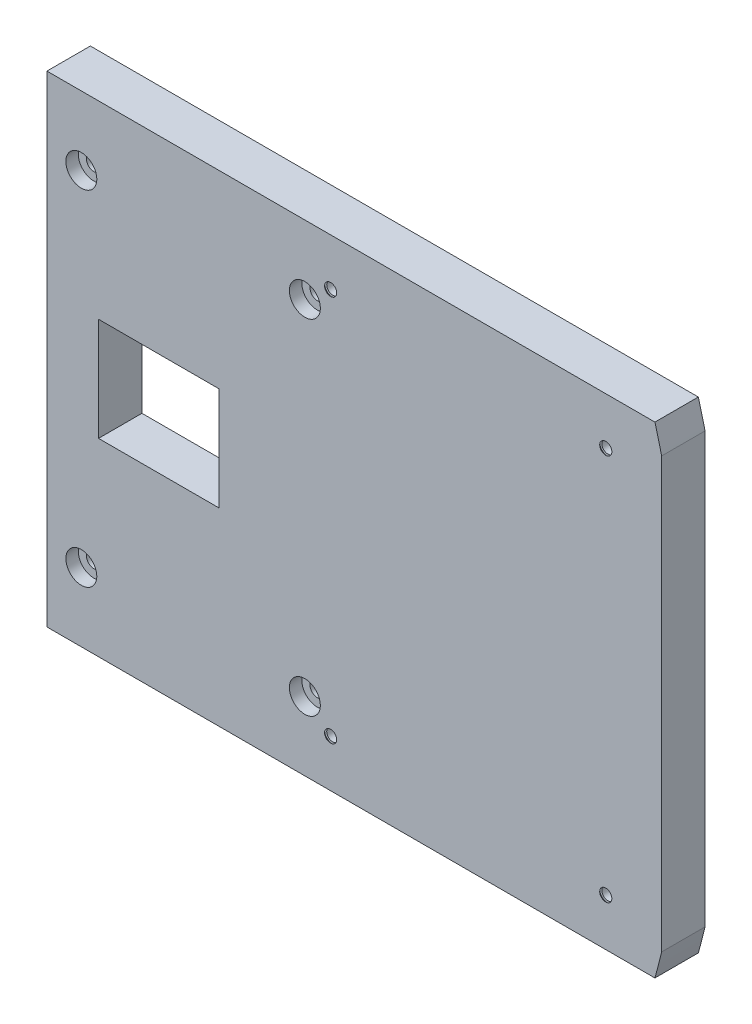
ISO-10303-21;
HEADER;
FILE_DESCRIPTION(('STEP AP214'),'2;1');
FILE_NAME('part.step','',(''),(''),'','','');
FILE_SCHEMA(('AUTOMOTIVE_DESIGN { 1 0 10303 214 1 1 1 1 }'));
ENDSEC;
DATA;
#1=APPLICATION_CONTEXT('core data for automotive mechanical design processes');
#2=APPLICATION_PROTOCOL_DEFINITION('international standard','automotive_design',2000,#1);
#3=PRODUCT_CONTEXT('',#1,'mechanical');
#4=PRODUCT('Part','Part','',(#3));
#5=PRODUCT_RELATED_PRODUCT_CATEGORY('part','',(#4));
#6=PRODUCT_DEFINITION_FORMATION('','',#4);
#7=PRODUCT_DEFINITION_CONTEXT('part definition',#1,'design');
#8=PRODUCT_DEFINITION('design','',#6,#7);
#9=PRODUCT_DEFINITION_SHAPE('','',#8);
#10=(LENGTH_UNIT() NAMED_UNIT(*) SI_UNIT(.MILLI.,.METRE.));
#11=(NAMED_UNIT(*) PLANE_ANGLE_UNIT() SI_UNIT($,.RADIAN.));
#12=(NAMED_UNIT(*) SI_UNIT($,.STERADIAN.) SOLID_ANGLE_UNIT());
#13=UNCERTAINTY_MEASURE_WITH_UNIT(LENGTH_MEASURE(1.E-05),#10,'distance_accuracy_value','');
#14=(GEOMETRIC_REPRESENTATION_CONTEXT(3) GLOBAL_UNCERTAINTY_ASSIGNED_CONTEXT((#13)) GLOBAL_UNIT_ASSIGNED_CONTEXT((#10,
#11,#12)) REPRESENTATION_CONTEXT('',''));
#15=CARTESIAN_POINT('',(0.,0.,0.));
#16=DIRECTION('',(0.,0.,1.));
#17=DIRECTION('',(1.,0.,0.));
#18=AXIS2_PLACEMENT_3D('',#15,#16,#17);
#19=CARTESIAN_POINT('',(192.,45.,234.61));
#20=DIRECTION('',(0.,0.,1.));
#21=DIRECTION('',(1.,0.,0.));
#22=AXIS2_PLACEMENT_3D('',#19,#20,#21);
#23=PLANE('',#22);
#24=CARTESIAN_POINT('',(192.,45.,234.61));
#25=DIRECTION('',(0.,0.,1.));
#26=DIRECTION('',(1.,0.,0.));
#27=AXIS2_PLACEMENT_3D('',#24,#25,#26);
#28=CIRCLE('',#27,1.4);
#29=CARTESIAN_POINT('',(193.4,45.,234.61));
#30=VERTEX_POINT('',#29);
#31=EDGE_CURVE('E9',#30,#30,#28,.T.);
#32=ORIENTED_EDGE('',*,*,#31,.F.);
#33=EDGE_LOOP('',(#32));
#34=FACE_BOUND('',#33,.T.);
#35=CARTESIAN_POINT('',(192.,45.,234.61));
#36=DIRECTION('',(0.,0.,1.));
#37=DIRECTION('',(1.,0.,0.));
#38=AXIS2_PLACEMENT_3D('',#35,#36,#37);
#39=CIRCLE('',#38,1.9);
#40=CARTESIAN_POINT('',(193.9,45.,234.61));
#41=VERTEX_POINT('',#40);
#42=EDGE_CURVE('E234',#41,#41,#39,.T.);
#43=ORIENTED_EDGE('',*,*,#42,.T.);
#44=EDGE_LOOP('',(#43));
#45=FACE_BOUND('',#44,.T.);
#46=ADVANCED_FACE('F14',(#34,#45),#23,.T.);
#47=CARTESIAN_POINT('',(128.,45.,234.61));
#48=DIRECTION('',(0.,0.,1.));
#49=DIRECTION('',(1.,0.,0.));
#50=AXIS2_PLACEMENT_3D('',#47,#48,#49);
#51=PLANE('',#50);
#52=CARTESIAN_POINT('',(128.,45.,234.61));
#53=DIRECTION('',(0.,0.,1.));
#54=DIRECTION('',(1.,0.,0.));
#55=AXIS2_PLACEMENT_3D('',#52,#53,#54);
#56=CIRCLE('',#55,1.4);
#57=CARTESIAN_POINT('',(129.4,45.,234.61));
#58=VERTEX_POINT('',#57);
#59=EDGE_CURVE('E310',#58,#58,#56,.T.);
#60=ORIENTED_EDGE('',*,*,#59,.F.);
#61=EDGE_LOOP('',(#60));
#62=FACE_BOUND('',#61,.T.);
#63=CARTESIAN_POINT('',(128.,45.,234.61));
#64=DIRECTION('',(0.,0.,1.));
#65=DIRECTION('',(1.,0.,0.));
#66=AXIS2_PLACEMENT_3D('',#63,#64,#65);
#67=CIRCLE('',#66,1.9);
#68=CARTESIAN_POINT('',(129.9,45.,234.61));
#69=VERTEX_POINT('',#68);
#70=EDGE_CURVE('E235',#69,#69,#67,.T.);
#71=ORIENTED_EDGE('',*,*,#70,.T.);
#72=EDGE_LOOP('',(#71));
#73=FACE_BOUND('',#72,.T.);
#74=ADVANCED_FACE('F549',(#62,#73),#51,.T.);
#75=CARTESIAN_POINT('',(122.,40.,232.2));
#76=DIRECTION('',(0.,0.,1.));
#77=DIRECTION('',(1.,0.,0.));
#78=AXIS2_PLACEMENT_3D('',#75,#76,#77);
#79=PLANE('',#78);
#80=CARTESIAN_POINT('',(122.,40.,232.2));
#81=DIRECTION('',(0.,0.,1.));
#82=DIRECTION('',(1.,0.,0.));
#83=AXIS2_PLACEMENT_3D('',#80,#81,#82);
#84=CIRCLE('',#83,1.7);
#85=CARTESIAN_POINT('',(123.7,40.,232.2));
#86=VERTEX_POINT('',#85);
#87=EDGE_CURVE('E276',#86,#86,#84,.T.);
#88=ORIENTED_EDGE('',*,*,#87,.F.);
#89=EDGE_LOOP('',(#88));
#90=FACE_BOUND('',#89,.T.);
#91=CARTESIAN_POINT('',(122.,40.,232.2));
#92=DIRECTION('',(0.,0.,1.));
#93=DIRECTION('',(1.,0.,0.));
#94=AXIS2_PLACEMENT_3D('',#91,#92,#93);
#95=CIRCLE('',#94,3.6);
#96=CARTESIAN_POINT('',(125.6,40.,232.2));
#97=VERTEX_POINT('',#96);
#98=EDGE_CURVE('E356',#97,#97,#95,.T.);
#99=ORIENTED_EDGE('',*,*,#98,.T.);
#100=EDGE_LOOP('',(#99));
#101=FACE_BOUND('',#100,.T.);
#102=ADVANCED_FACE('F528',(#90,#101),#79,.T.);
#103=CARTESIAN_POINT('',(70.,40.,232.2));
#104=DIRECTION('',(0.,0.,1.));
#105=DIRECTION('',(1.,0.,0.));
#106=AXIS2_PLACEMENT_3D('',#103,#104,#105);
#107=PLANE('',#106);
#108=CARTESIAN_POINT('',(70.,40.,232.2));
#109=DIRECTION('',(0.,0.,1.));
#110=DIRECTION('',(1.,0.,0.));
#111=AXIS2_PLACEMENT_3D('',#108,#109,#110);
#112=CIRCLE('',#111,1.7);
#113=CARTESIAN_POINT('',(71.7,40.,232.2));
#114=VERTEX_POINT('',#113);
#115=EDGE_CURVE('E371',#114,#114,#112,.T.);
#116=ORIENTED_EDGE('',*,*,#115,.F.);
#117=EDGE_LOOP('',(#116));
#118=FACE_BOUND('',#117,.T.);
#119=CARTESIAN_POINT('',(70.,40.,232.2));
#120=DIRECTION('',(0.,0.,1.));
#121=DIRECTION('',(1.,0.,0.));
#122=AXIS2_PLACEMENT_3D('',#119,#120,#121);
#123=CIRCLE('',#122,3.6);
#124=CARTESIAN_POINT('',(73.6,40.,232.2));
#125=VERTEX_POINT('',#124);
#126=EDGE_CURVE('E375',#125,#125,#123,.T.);
#127=ORIENTED_EDGE('',*,*,#126,.T.);
#128=EDGE_LOOP('',(#127));
#129=FACE_BOUND('',#128,.T.);
#130=ADVANCED_FACE('F587',(#118,#129),#107,.T.);
#131=CARTESIAN_POINT('',(192.,-45.,234.61));
#132=DIRECTION('',(0.,0.,1.));
#133=DIRECTION('',(1.,0.,0.));
#134=AXIS2_PLACEMENT_3D('',#131,#132,#133);
#135=PLANE('',#134);
#136=CARTESIAN_POINT('',(192.,-45.,234.61));
#137=DIRECTION('',(0.,0.,1.));
#138=DIRECTION('',(1.,0.,0.));
#139=AXIS2_PLACEMENT_3D('',#136,#137,#138);
#140=CIRCLE('',#139,1.4);
#141=CARTESIAN_POINT('',(193.4,-45.,234.61));
#142=VERTEX_POINT('',#141);
#143=EDGE_CURVE('E372',#142,#142,#140,.T.);
#144=ORIENTED_EDGE('',*,*,#143,.F.);
#145=EDGE_LOOP('',(#144));
#146=FACE_BOUND('',#145,.T.);
#147=CARTESIAN_POINT('',(192.,-45.,234.61));
#148=DIRECTION('',(0.,0.,1.));
#149=DIRECTION('',(1.,0.,0.));
#150=AXIS2_PLACEMENT_3D('',#147,#148,#149);
#151=CIRCLE('',#150,1.9);
#152=CARTESIAN_POINT('',(193.9,-45.,234.61));
#153=VERTEX_POINT('',#152);
#154=EDGE_CURVE('E241',#153,#153,#151,.T.);
#155=ORIENTED_EDGE('',*,*,#154,.T.);
#156=EDGE_LOOP('',(#155));
#157=FACE_BOUND('',#156,.T.);
#158=ADVANCED_FACE('F579',(#146,#157),#135,.T.);
#159=CARTESIAN_POINT('',(122.,-40.,232.2));
#160=DIRECTION('',(0.,0.,1.));
#161=DIRECTION('',(1.,0.,0.));
#162=AXIS2_PLACEMENT_3D('',#159,#160,#161);
#163=PLANE('',#162);
#164=CARTESIAN_POINT('',(122.,-40.,232.2));
#165=DIRECTION('',(0.,0.,1.));
#166=DIRECTION('',(1.,0.,0.));
#167=AXIS2_PLACEMENT_3D('',#164,#165,#166);
#168=CIRCLE('',#167,1.7);
#169=CARTESIAN_POINT('',(123.7,-40.,232.2));
#170=VERTEX_POINT('',#169);
#171=EDGE_CURVE('E265',#170,#170,#168,.T.);
#172=ORIENTED_EDGE('',*,*,#171,.F.);
#173=EDGE_LOOP('',(#172));
#174=FACE_BOUND('',#173,.T.);
#175=CARTESIAN_POINT('',(122.,-40.,232.2));
#176=DIRECTION('',(0.,0.,1.));
#177=DIRECTION('',(1.,0.,0.));
#178=AXIS2_PLACEMENT_3D('',#175,#176,#177);
#179=CIRCLE('',#178,3.6);
#180=CARTESIAN_POINT('',(125.6,-40.,232.2));
#181=VERTEX_POINT('',#180);
#182=EDGE_CURVE('E327',#181,#181,#179,.T.);
#183=ORIENTED_EDGE('',*,*,#182,.T.);
#184=EDGE_LOOP('',(#183));
#185=FACE_BOUND('',#184,.T.);
#186=ADVANCED_FACE('F576',(#174,#185),#163,.T.);
#187=CARTESIAN_POINT('',(128.,-45.,234.61));
#188=DIRECTION('',(0.,0.,1.));
#189=DIRECTION('',(1.,0.,0.));
#190=AXIS2_PLACEMENT_3D('',#187,#188,#189);
#191=PLANE('',#190);
#192=CARTESIAN_POINT('',(128.,-45.,234.61));
#193=DIRECTION('',(0.,0.,1.));
#194=DIRECTION('',(1.,0.,0.));
#195=AXIS2_PLACEMENT_3D('',#192,#193,#194);
#196=CIRCLE('',#195,1.4);
#197=CARTESIAN_POINT('',(129.4,-45.,234.61));
#198=VERTEX_POINT('',#197);
#199=EDGE_CURVE('E266',#198,#198,#196,.T.);
#200=ORIENTED_EDGE('',*,*,#199,.F.);
#201=EDGE_LOOP('',(#200));
#202=FACE_BOUND('',#201,.T.);
#203=CARTESIAN_POINT('',(128.,-45.,234.61));
#204=DIRECTION('',(0.,0.,1.));
#205=DIRECTION('',(1.,0.,0.));
#206=AXIS2_PLACEMENT_3D('',#203,#204,#205);
#207=CIRCLE('',#206,1.9);
#208=CARTESIAN_POINT('',(129.9,-45.,234.61));
#209=VERTEX_POINT('',#208);
#210=EDGE_CURVE('E328',#209,#209,#207,.T.);
#211=ORIENTED_EDGE('',*,*,#210,.T.);
#212=EDGE_LOOP('',(#211));
#213=FACE_BOUND('',#212,.T.);
#214=ADVANCED_FACE('F578',(#202,#213),#191,.T.);
#215=CARTESIAN_POINT('',(70.,-40.,232.2));
#216=DIRECTION('',(0.,0.,1.));
#217=DIRECTION('',(1.,0.,0.));
#218=AXIS2_PLACEMENT_3D('',#215,#216,#217);
#219=PLANE('',#218);
#220=CARTESIAN_POINT('',(70.,-40.,232.2));
#221=DIRECTION('',(0.,0.,1.));
#222=DIRECTION('',(1.,0.,0.));
#223=AXIS2_PLACEMENT_3D('',#220,#221,#222);
#224=CIRCLE('',#223,1.7);
#225=CARTESIAN_POINT('',(71.7,-40.,232.2));
#226=VERTEX_POINT('',#225);
#227=EDGE_CURVE('E351',#226,#226,#224,.T.);
#228=ORIENTED_EDGE('',*,*,#227,.F.);
#229=EDGE_LOOP('',(#228));
#230=FACE_BOUND('',#229,.T.);
#231=CARTESIAN_POINT('',(70.,-40.,232.2));
#232=DIRECTION('',(0.,0.,1.));
#233=DIRECTION('',(1.,0.,0.));
#234=AXIS2_PLACEMENT_3D('',#231,#232,#233);
#235=CIRCLE('',#234,3.6);
#236=CARTESIAN_POINT('',(73.6,-40.,232.2));
#237=VERTEX_POINT('',#236);
#238=EDGE_CURVE('E347',#237,#237,#235,.T.);
#239=ORIENTED_EDGE('',*,*,#238,.T.);
#240=EDGE_LOOP('',(#239));
#241=FACE_BOUND('',#240,.T.);
#242=ADVANCED_FACE('F664',(#230,#241),#219,.T.);
#243=CARTESIAN_POINT('',(192.,45.,224.89));
#244=DIRECTION('',(0.,0.,1.));
#245=DIRECTION('',(1.,0.,0.));
#246=AXIS2_PLACEMENT_3D('',#243,#244,#245);
#247=CYLINDRICAL_SURFACE('',#246,1.4);
#248=CARTESIAN_POINT('',(192.,45.,225.));
#249=DIRECTION('',(0.,0.,1.));
#250=DIRECTION('',(1.,0.,0.));
#251=AXIS2_PLACEMENT_3D('',#248,#249,#250);
#252=CIRCLE('',#251,1.4);
#253=CARTESIAN_POINT('',(193.4,45.,225.));
#254=VERTEX_POINT('',#253);
#255=EDGE_CURVE('E196',#254,#254,#252,.T.);
#256=ORIENTED_EDGE('',*,*,#255,.F.);
#257=DIRECTION('',(0.,0.,1.));
#258=VECTOR('',#257,1.);
#259=CARTESIAN_POINT('',(193.4,45.,224.89));
#260=LINE('',#259,#258);
#261=EDGE_CURVE('E25',#254,#30,#260,.T.);
#262=ORIENTED_EDGE('',*,*,#261,.T.);
#263=ORIENTED_EDGE('',*,*,#31,.T.);
#264=ORIENTED_EDGE('',*,*,#261,.F.);
#265=EDGE_LOOP('',(#256,#262,#263,#264));
#266=FACE_BOUND('',#265,.T.);
#267=ADVANCED_FACE('F669',(#266),#247,.F.);
#268=CARTESIAN_POINT('',(128.,45.,224.89));
#269=DIRECTION('',(0.,0.,1.));
#270=DIRECTION('',(1.,0.,0.));
#271=AXIS2_PLACEMENT_3D('',#268,#269,#270);
#272=CYLINDRICAL_SURFACE('',#271,1.4);
#273=CARTESIAN_POINT('',(128.,45.,225.));
#274=DIRECTION('',(0.,0.,1.));
#275=DIRECTION('',(1.,0.,0.));
#276=AXIS2_PLACEMENT_3D('',#273,#274,#275);
#277=CIRCLE('',#276,1.4);
#278=CARTESIAN_POINT('',(129.4,45.,225.));
#279=VERTEX_POINT('',#278);
#280=EDGE_CURVE('E259',#279,#279,#277,.T.);
#281=ORIENTED_EDGE('',*,*,#280,.F.);
#282=DIRECTION('',(0.,0.,1.));
#283=VECTOR('',#282,1.);
#284=CARTESIAN_POINT('',(129.4,45.,224.89));
#285=LINE('',#284,#283);
#286=EDGE_CURVE('E279',#279,#58,#285,.T.);
#287=ORIENTED_EDGE('',*,*,#286,.T.);
#288=ORIENTED_EDGE('',*,*,#59,.T.);
#289=ORIENTED_EDGE('',*,*,#286,.F.);
#290=EDGE_LOOP('',(#281,#287,#288,#289));
#291=FACE_BOUND('',#290,.T.);
#292=ADVANCED_FACE('F678',(#291),#272,.F.);
#293=CARTESIAN_POINT('',(122.,40.,224.99));
#294=DIRECTION('',(0.,0.,1.));
#295=DIRECTION('',(1.,0.,0.));
#296=AXIS2_PLACEMENT_3D('',#293,#294,#295);
#297=CYLINDRICAL_SURFACE('',#296,1.7);
#298=CARTESIAN_POINT('',(122.,40.,225.));
#299=DIRECTION('',(0.,0.,1.));
#300=DIRECTION('',(1.,0.,0.));
#301=AXIS2_PLACEMENT_3D('',#298,#299,#300);
#302=CIRCLE('',#301,1.7);
#303=CARTESIAN_POINT('',(123.7,40.,225.));
#304=VERTEX_POINT('',#303);
#305=EDGE_CURVE('E255',#304,#304,#302,.T.);
#306=ORIENTED_EDGE('',*,*,#305,.F.);
#307=DIRECTION('',(0.,0.,1.));
#308=VECTOR('',#307,1.);
#309=CARTESIAN_POINT('',(123.7,40.,224.99));
#310=LINE('',#309,#308);
#311=EDGE_CURVE('E280',#304,#86,#310,.T.);
#312=ORIENTED_EDGE('',*,*,#311,.T.);
#313=ORIENTED_EDGE('',*,*,#87,.T.);
#314=ORIENTED_EDGE('',*,*,#311,.F.);
#315=EDGE_LOOP('',(#306,#312,#313,#314));
#316=FACE_BOUND('',#315,.T.);
#317=ADVANCED_FACE('F628',(#316),#297,.F.);
#318=CARTESIAN_POINT('',(70.,40.,224.99));
#319=DIRECTION('',(0.,0.,1.));
#320=DIRECTION('',(1.,0.,0.));
#321=AXIS2_PLACEMENT_3D('',#318,#319,#320);
#322=CYLINDRICAL_SURFACE('',#321,1.7);
#323=CARTESIAN_POINT('',(70.,40.,225.));
#324=DIRECTION('',(0.,0.,1.));
#325=DIRECTION('',(1.,0.,0.));
#326=AXIS2_PLACEMENT_3D('',#323,#324,#325);
#327=CIRCLE('',#326,1.7);
#328=CARTESIAN_POINT('',(71.7,40.,225.));
#329=VERTEX_POINT('',#328);
#330=EDGE_CURVE('E260',#329,#329,#327,.T.);
#331=ORIENTED_EDGE('',*,*,#330,.F.);
#332=DIRECTION('',(0.,0.,1.));
#333=VECTOR('',#332,1.);
#334=CARTESIAN_POINT('',(71.7,40.,224.99));
#335=LINE('',#334,#333);
#336=EDGE_CURVE('E367',#329,#114,#335,.T.);
#337=ORIENTED_EDGE('',*,*,#336,.T.);
#338=ORIENTED_EDGE('',*,*,#115,.T.);
#339=ORIENTED_EDGE('',*,*,#336,.F.);
#340=EDGE_LOOP('',(#331,#337,#338,#339));
#341=FACE_BOUND('',#340,.T.);
#342=ADVANCED_FACE('F620',(#341),#322,.F.);
#343=CARTESIAN_POINT('',(192.,-45.,224.89));
#344=DIRECTION('',(0.,0.,1.));
#345=DIRECTION('',(1.,0.,0.));
#346=AXIS2_PLACEMENT_3D('',#343,#344,#345);
#347=CYLINDRICAL_SURFACE('',#346,1.4);
#348=CARTESIAN_POINT('',(192.,-45.,225.));
#349=DIRECTION('',(0.,0.,1.));
#350=DIRECTION('',(1.,0.,0.));
#351=AXIS2_PLACEMENT_3D('',#348,#349,#350);
#352=CIRCLE('',#351,1.4);
#353=CARTESIAN_POINT('',(193.4,-45.,225.));
#354=VERTEX_POINT('',#353);
#355=EDGE_CURVE('E313',#354,#354,#352,.T.);
#356=ORIENTED_EDGE('',*,*,#355,.F.);
#357=DIRECTION('',(0.,0.,1.));
#358=VECTOR('',#357,1.);
#359=CARTESIAN_POINT('',(193.4,-45.,224.89));
#360=LINE('',#359,#358);
#361=EDGE_CURVE('E359',#354,#142,#360,.T.);
#362=ORIENTED_EDGE('',*,*,#361,.T.);
#363=ORIENTED_EDGE('',*,*,#143,.T.);
#364=ORIENTED_EDGE('',*,*,#361,.F.);
#365=EDGE_LOOP('',(#356,#362,#363,#364));
#366=FACE_BOUND('',#365,.T.);
#367=ADVANCED_FACE('F618',(#366),#347,.F.);
#368=CARTESIAN_POINT('',(122.,-40.,224.99));
#369=DIRECTION('',(0.,0.,1.));
#370=DIRECTION('',(1.,0.,0.));
#371=AXIS2_PLACEMENT_3D('',#368,#369,#370);
#372=CYLINDRICAL_SURFACE('',#371,1.7);
#373=CARTESIAN_POINT('',(122.,-40.,225.));
#374=DIRECTION('',(0.,0.,1.));
#375=DIRECTION('',(1.,0.,0.));
#376=AXIS2_PLACEMENT_3D('',#373,#374,#375);
#377=CIRCLE('',#376,1.7);
#378=CARTESIAN_POINT('',(123.7,-40.,225.));
#379=VERTEX_POINT('',#378);
#380=EDGE_CURVE('E443',#379,#379,#377,.T.);
#381=ORIENTED_EDGE('',*,*,#380,.F.);
#382=DIRECTION('',(0.,0.,1.));
#383=VECTOR('',#382,1.);
#384=CARTESIAN_POINT('',(123.7,-40.,224.99));
#385=LINE('',#384,#383);
#386=EDGE_CURVE('E261',#379,#170,#385,.T.);
#387=ORIENTED_EDGE('',*,*,#386,.T.);
#388=ORIENTED_EDGE('',*,*,#171,.T.);
#389=ORIENTED_EDGE('',*,*,#386,.F.);
#390=EDGE_LOOP('',(#381,#387,#388,#389));
#391=FACE_BOUND('',#390,.T.);
#392=ADVANCED_FACE('F616',(#391),#372,.F.);
#393=CARTESIAN_POINT('',(128.,-45.,224.89));
#394=DIRECTION('',(0.,0.,1.));
#395=DIRECTION('',(1.,0.,0.));
#396=AXIS2_PLACEMENT_3D('',#393,#394,#395);
#397=CYLINDRICAL_SURFACE('',#396,1.4);
#398=CARTESIAN_POINT('',(128.,-45.,225.));
#399=DIRECTION('',(0.,0.,1.));
#400=DIRECTION('',(1.,0.,0.));
#401=AXIS2_PLACEMENT_3D('',#398,#399,#400);
#402=CIRCLE('',#401,1.4);
#403=CARTESIAN_POINT('',(129.4,-45.,225.));
#404=VERTEX_POINT('',#403);
#405=EDGE_CURVE('E439',#404,#404,#402,.T.);
#406=ORIENTED_EDGE('',*,*,#405,.F.);
#407=DIRECTION('',(0.,0.,1.));
#408=VECTOR('',#407,1.);
#409=CARTESIAN_POINT('',(129.4,-45.,224.89));
#410=LINE('',#409,#408);
#411=EDGE_CURVE('E650',#404,#198,#410,.T.);
#412=ORIENTED_EDGE('',*,*,#411,.T.);
#413=ORIENTED_EDGE('',*,*,#199,.T.);
#414=ORIENTED_EDGE('',*,*,#411,.F.);
#415=EDGE_LOOP('',(#406,#412,#413,#414));
#416=FACE_BOUND('',#415,.T.);
#417=ADVANCED_FACE('F567',(#416),#397,.F.);
#418=CARTESIAN_POINT('',(70.,-40.,224.99));
#419=DIRECTION('',(0.,0.,1.));
#420=DIRECTION('',(1.,0.,0.));
#421=AXIS2_PLACEMENT_3D('',#418,#419,#420);
#422=CYLINDRICAL_SURFACE('',#421,1.7);
#423=CARTESIAN_POINT('',(70.,-40.,225.));
#424=DIRECTION('',(0.,0.,1.));
#425=DIRECTION('',(1.,0.,0.));
#426=AXIS2_PLACEMENT_3D('',#423,#424,#425);
#427=CIRCLE('',#426,1.7);
#428=CARTESIAN_POINT('',(71.7,-40.,225.));
#429=VERTEX_POINT('',#428);
#430=EDGE_CURVE('E207',#429,#429,#427,.T.);
#431=ORIENTED_EDGE('',*,*,#430,.F.);
#432=DIRECTION('',(0.,0.,1.));
#433=VECTOR('',#432,1.);
#434=CARTESIAN_POINT('',(71.7,-40.,224.99));
#435=LINE('',#434,#433);
#436=EDGE_CURVE('E363',#429,#226,#435,.T.);
#437=ORIENTED_EDGE('',*,*,#436,.T.);
#438=ORIENTED_EDGE('',*,*,#227,.T.);
#439=ORIENTED_EDGE('',*,*,#436,.F.);
#440=EDGE_LOOP('',(#431,#437,#438,#439));
#441=FACE_BOUND('',#440,.T.);
#442=ADVANCED_FACE('F564',(#441),#422,.F.);
#443=CARTESIAN_POINT('',(192.,45.,234.61));
#444=DIRECTION('',(0.,0.,-1.));
#445=DIRECTION('',(1.,0.,0.));
#446=AXIS2_PLACEMENT_3D('',#443,#444,#445);
#447=CONICAL_SURFACE('',#446,1.9,0.785398163397);
#448=DIRECTION('',(-0.707106781186548,0.,0.707106781186548));
#449=VECTOR('',#448,1.);
#450=CARTESIAN_POINT('',(193.9,45.,234.61));
#451=LINE('',#450,#449);
#452=CARTESIAN_POINT('',(193.41,45.,235.1));
#453=VERTEX_POINT('',#452);
#454=EDGE_CURVE('E230',#41,#453,#451,.T.);
#455=ORIENTED_EDGE('',*,*,#454,.F.);
#456=ORIENTED_EDGE('',*,*,#42,.F.);
#457=ORIENTED_EDGE('',*,*,#454,.T.);
#458=CARTESIAN_POINT('',(192.,45.,235.1));
#459=DIRECTION('',(0.,0.,1.));
#460=DIRECTION('',(1.,0.,0.));
#461=AXIS2_PLACEMENT_3D('',#458,#459,#460);
#462=CIRCLE('',#461,1.41);
#463=EDGE_CURVE('E284',#453,#453,#462,.T.);
#464=ORIENTED_EDGE('',*,*,#463,.T.);
#465=EDGE_LOOP('',(#455,#456,#457,#464));
#466=FACE_BOUND('',#465,.T.);
#467=ADVANCED_FACE('F543',(#466),#447,.F.);
#468=CARTESIAN_POINT('',(128.,45.,234.61));
#469=DIRECTION('',(0.,0.,-1.));
#470=DIRECTION('',(1.,0.,0.));
#471=AXIS2_PLACEMENT_3D('',#468,#469,#470);
#472=CONICAL_SURFACE('',#471,1.9,0.785398163397);
#473=DIRECTION('',(-0.707106781186548,0.,0.707106781186548));
#474=VECTOR('',#473,1.);
#475=CARTESIAN_POINT('',(129.9,45.,234.61));
#476=LINE('',#475,#474);
#477=CARTESIAN_POINT('',(129.41,45.,235.1));
#478=VERTEX_POINT('',#477);
#479=EDGE_CURVE('E353',#69,#478,#476,.T.);
#480=ORIENTED_EDGE('',*,*,#479,.F.);
#481=ORIENTED_EDGE('',*,*,#70,.F.);
#482=ORIENTED_EDGE('',*,*,#479,.T.);
#483=CARTESIAN_POINT('',(128.,45.,235.1));
#484=DIRECTION('',(0.,0.,1.));
#485=DIRECTION('',(1.,0.,0.));
#486=AXIS2_PLACEMENT_3D('',#483,#484,#485);
#487=CIRCLE('',#486,1.41);
#488=EDGE_CURVE('E299',#478,#478,#487,.T.);
#489=ORIENTED_EDGE('',*,*,#488,.T.);
#490=EDGE_LOOP('',(#480,#481,#482,#489));
#491=FACE_BOUND('',#490,.T.);
#492=ADVANCED_FACE('F534',(#491),#472,.F.);
#493=CARTESIAN_POINT('',(122.,40.,232.2));
#494=DIRECTION('',(0.,0.,1.));
#495=DIRECTION('',(1.,0.,0.));
#496=AXIS2_PLACEMENT_3D('',#493,#494,#495);
#497=CYLINDRICAL_SURFACE('',#496,3.6);
#498=DIRECTION('',(0.,0.,1.));
#499=VECTOR('',#498,1.);
#500=CARTESIAN_POINT('',(125.6,40.,232.2));
#501=LINE('',#500,#499);
#502=CARTESIAN_POINT('',(125.6,40.,235.1));
#503=VERTEX_POINT('',#502);
#504=EDGE_CURVE('E377',#97,#503,#501,.T.);
#505=ORIENTED_EDGE('',*,*,#504,.F.);
#506=ORIENTED_EDGE('',*,*,#98,.F.);
#507=ORIENTED_EDGE('',*,*,#504,.T.);
#508=CARTESIAN_POINT('',(122.,40.,235.1));
#509=DIRECTION('',(0.,0.,1.));
#510=DIRECTION('',(1.,0.,0.));
#511=AXIS2_PLACEMENT_3D('',#508,#509,#510);
#512=CIRCLE('',#511,3.6);
#513=EDGE_CURVE('E290',#503,#503,#512,.T.);
#514=ORIENTED_EDGE('',*,*,#513,.T.);
#515=EDGE_LOOP('',(#505,#506,#507,#514));
#516=FACE_BOUND('',#515,.T.);
#517=ADVANCED_FACE('F531',(#516),#497,.F.);
#518=CARTESIAN_POINT('',(70.,40.,232.2));
#519=DIRECTION('',(0.,0.,1.));
#520=DIRECTION('',(1.,0.,0.));
#521=AXIS2_PLACEMENT_3D('',#518,#519,#520);
#522=CYLINDRICAL_SURFACE('',#521,3.6);
#523=DIRECTION('',(0.,0.,1.));
#524=VECTOR('',#523,1.);
#525=CARTESIAN_POINT('',(73.6,40.,232.2));
#526=LINE('',#525,#524);
#527=CARTESIAN_POINT('',(73.6,40.,235.1));
#528=VERTEX_POINT('',#527);
#529=EDGE_CURVE('E378',#125,#528,#526,.T.);
#530=ORIENTED_EDGE('',*,*,#529,.F.);
#531=ORIENTED_EDGE('',*,*,#126,.F.);
#532=ORIENTED_EDGE('',*,*,#529,.T.);
#533=CARTESIAN_POINT('',(70.,40.,235.1));
#534=DIRECTION('',(0.,0.,1.));
#535=DIRECTION('',(1.,0.,0.));
#536=AXIS2_PLACEMENT_3D('',#533,#534,#535);
#537=CIRCLE('',#536,3.6);
#538=EDGE_CURVE('E228',#528,#528,#537,.T.);
#539=ORIENTED_EDGE('',*,*,#538,.T.);
#540=EDGE_LOOP('',(#530,#531,#532,#539));
#541=FACE_BOUND('',#540,.T.);
#542=ADVANCED_FACE('F533',(#541),#522,.F.);
#543=CARTESIAN_POINT('',(74.,-12.,224.));
#544=DIRECTION('',(1.,0.,0.));
#545=DIRECTION('',(0.,1.,0.));
#546=AXIS2_PLACEMENT_3D('',#543,#544,#545);
#547=PLANE('',#546);
#548=DIRECTION('',(0.,0.,1.));
#549=VECTOR('',#548,1.);
#550=CARTESIAN_POINT('',(74.,-12.,224.));
#551=LINE('',#550,#549);
#552=CARTESIAN_POINT('',(74.,-12.,225.));
#553=VERTEX_POINT('',#552);
#554=CARTESIAN_POINT('',(74.,-12.,235.1));
#555=VERTEX_POINT('',#554);
#556=EDGE_CURVE('E404',#553,#555,#551,.T.);
#557=ORIENTED_EDGE('',*,*,#556,.F.);
#558=DIRECTION('',(0.,1.,0.));
#559=VECTOR('',#558,1.);
#560=CARTESIAN_POINT('',(74.,-34.,225.));
#561=LINE('',#560,#559);
#562=CARTESIAN_POINT('',(74.,12.,225.));
#563=VERTEX_POINT('',#562);
#564=EDGE_CURVE('E253',#553,#563,#561,.T.);
#565=ORIENTED_EDGE('',*,*,#564,.T.);
#566=DIRECTION('',(0.,0.,1.));
#567=VECTOR('',#566,1.);
#568=CARTESIAN_POINT('',(74.,12.,224.));
#569=LINE('',#568,#567);
#570=CARTESIAN_POINT('',(74.,12.,235.1));
#571=VERTEX_POINT('',#570);
#572=EDGE_CURVE('E399',#563,#571,#569,.T.);
#573=ORIENTED_EDGE('',*,*,#572,.T.);
#574=DIRECTION('',(0.,1.,0.));
#575=VECTOR('',#574,1.);
#576=CARTESIAN_POINT('',(74.,-34.,235.1));
#577=LINE('',#576,#575);
#578=EDGE_CURVE('E389',#555,#571,#577,.T.);
#579=ORIENTED_EDGE('',*,*,#578,.F.);
#580=EDGE_LOOP('',(#557,#565,#573,#579));
#581=FACE_BOUND('',#580,.T.);
#582=ADVANCED_FACE('F541',(#581),#547,.T.);
#583=CARTESIAN_POINT('',(74.,12.,224.));
#584=DIRECTION('',(0.,1.,0.));
#585=DIRECTION('',(1.,0.,0.));
#586=AXIS2_PLACEMENT_3D('',#583,#584,#585);
#587=PLANE('',#586);
#588=DIRECTION('',(-1.,0.,0.));
#589=VECTOR('',#588,1.);
#590=CARTESIAN_POINT('',(68.,12.,235.1));
#591=LINE('',#590,#589);
#592=CARTESIAN_POINT('',(102.,12.,235.1));
#593=VERTEX_POINT('',#592);
#594=EDGE_CURVE('E229',#593,#571,#591,.T.);
#595=ORIENTED_EDGE('',*,*,#594,.T.);
#596=ORIENTED_EDGE('',*,*,#572,.F.);
#597=DIRECTION('',(-1.,0.,0.));
#598=VECTOR('',#597,1.);
#599=CARTESIAN_POINT('',(68.,12.,225.));
#600=LINE('',#599,#598);
#601=CARTESIAN_POINT('',(102.,12.,225.));
#602=VERTEX_POINT('',#601);
#603=EDGE_CURVE('E249',#602,#563,#600,.T.);
#604=ORIENTED_EDGE('',*,*,#603,.F.);
#605=DIRECTION('',(0.,0.,1.));
#606=VECTOR('',#605,1.);
#607=CARTESIAN_POINT('',(102.,12.,224.));
#608=LINE('',#607,#606);
#609=EDGE_CURVE('E400',#602,#593,#608,.T.);
#610=ORIENTED_EDGE('',*,*,#609,.T.);
#611=EDGE_LOOP('',(#595,#596,#604,#610));
#612=FACE_BOUND('',#611,.T.);
#613=ADVANCED_FACE('F560',(#612),#587,.F.);
#614=CARTESIAN_POINT('',(102.,-12.,224.));
#615=DIRECTION('',(1.,0.,0.));
#616=DIRECTION('',(0.,1.,0.));
#617=AXIS2_PLACEMENT_3D('',#614,#615,#616);
#618=PLANE('',#617);
#619=DIRECTION('',(0.,1.,0.));
#620=VECTOR('',#619,1.);
#621=CARTESIAN_POINT('',(102.,-34.,235.1));
#622=LINE('',#621,#620);
#623=CARTESIAN_POINT('',(102.,-12.,235.1));
#624=VERTEX_POINT('',#623);
#625=EDGE_CURVE('E224',#624,#593,#622,.T.);
#626=ORIENTED_EDGE('',*,*,#625,.T.);
#627=ORIENTED_EDGE('',*,*,#609,.F.);
#628=DIRECTION('',(0.,1.,0.));
#629=VECTOR('',#628,1.);
#630=CARTESIAN_POINT('',(102.,-34.,225.));
#631=LINE('',#630,#629);
#632=CARTESIAN_POINT('',(102.,-12.,225.));
#633=VERTEX_POINT('',#632);
#634=EDGE_CURVE('E254',#633,#602,#631,.T.);
#635=ORIENTED_EDGE('',*,*,#634,.F.);
#636=DIRECTION('',(0.,0.,1.));
#637=VECTOR('',#636,1.);
#638=CARTESIAN_POINT('',(102.,-12.,224.));
#639=LINE('',#638,#637);
#640=EDGE_CURVE('E243',#633,#624,#639,.T.);
#641=ORIENTED_EDGE('',*,*,#640,.T.);
#642=EDGE_LOOP('',(#626,#627,#635,#641));
#643=FACE_BOUND('',#642,.T.);
#644=ADVANCED_FACE('F596',(#643),#618,.F.);
#645=CARTESIAN_POINT('',(74.,-12.,224.));
#646=DIRECTION('',(0.,1.,0.));
#647=DIRECTION('',(1.,0.,0.));
#648=AXIS2_PLACEMENT_3D('',#645,#646,#647);
#649=PLANE('',#648);
#650=ORIENTED_EDGE('',*,*,#640,.F.);
#651=DIRECTION('',(-1.,0.,0.));
#652=VECTOR('',#651,1.);
#653=CARTESIAN_POINT('',(68.,-12.,225.));
#654=LINE('',#653,#652);
#655=EDGE_CURVE('E18',#633,#553,#654,.T.);
#656=ORIENTED_EDGE('',*,*,#655,.T.);
#657=ORIENTED_EDGE('',*,*,#556,.T.);
#658=DIRECTION('',(-1.,0.,0.));
#659=VECTOR('',#658,1.);
#660=CARTESIAN_POINT('',(68.,-12.,235.1));
#661=LINE('',#660,#659);
#662=EDGE_CURVE('E393',#624,#555,#661,.T.);
#663=ORIENTED_EDGE('',*,*,#662,.F.);
#664=EDGE_LOOP('',(#650,#656,#657,#663));
#665=FACE_BOUND('',#664,.T.);
#666=ADVANCED_FACE('F585',(#665),#649,.T.);
#667=CARTESIAN_POINT('',(192.,-45.,234.61));
#668=DIRECTION('',(0.,0.,-1.));
#669=DIRECTION('',(1.,0.,0.));
#670=AXIS2_PLACEMENT_3D('',#667,#668,#669);
#671=CONICAL_SURFACE('',#670,1.9,0.785398163397);
#672=DIRECTION('',(-0.707106781186548,0.,0.707106781186548));
#673=VECTOR('',#672,1.);
#674=CARTESIAN_POINT('',(193.9,-45.,234.61));
#675=LINE('',#674,#673);
#676=CARTESIAN_POINT('',(193.41,-45.,235.1));
#677=VERTEX_POINT('',#676);
#678=EDGE_CURVE('E244',#153,#677,#675,.T.);
#679=ORIENTED_EDGE('',*,*,#678,.F.);
#680=ORIENTED_EDGE('',*,*,#154,.F.);
#681=ORIENTED_EDGE('',*,*,#678,.T.);
#682=CARTESIAN_POINT('',(192.,-45.,235.1));
#683=DIRECTION('',(0.,0.,1.));
#684=DIRECTION('',(1.,0.,0.));
#685=AXIS2_PLACEMENT_3D('',#682,#683,#684);
#686=CIRCLE('',#685,1.41);
#687=EDGE_CURVE('E271',#677,#677,#686,.T.);
#688=ORIENTED_EDGE('',*,*,#687,.T.);
#689=EDGE_LOOP('',(#679,#680,#681,#688));
#690=FACE_BOUND('',#689,.T.);
#691=ADVANCED_FACE('F582',(#690),#671,.F.);
#692=CARTESIAN_POINT('',(122.,-40.,232.2));
#693=DIRECTION('',(0.,0.,1.));
#694=DIRECTION('',(1.,0.,0.));
#695=AXIS2_PLACEMENT_3D('',#692,#693,#694);
#696=CYLINDRICAL_SURFACE('',#695,3.6);
#697=DIRECTION('',(0.,0.,1.));
#698=VECTOR('',#697,1.);
#699=CARTESIAN_POINT('',(125.6,-40.,232.2));
#700=LINE('',#699,#698);
#701=CARTESIAN_POINT('',(125.6,-40.,235.1));
#702=VERTEX_POINT('',#701);
#703=EDGE_CURVE('E325',#181,#702,#700,.T.);
#704=ORIENTED_EDGE('',*,*,#703,.F.);
#705=ORIENTED_EDGE('',*,*,#182,.F.);
#706=ORIENTED_EDGE('',*,*,#703,.T.);
#707=CARTESIAN_POINT('',(122.,-40.,235.1));
#708=DIRECTION('',(0.,0.,1.));
#709=DIRECTION('',(1.,0.,0.));
#710=AXIS2_PLACEMENT_3D('',#707,#708,#709);
#711=CIRCLE('',#710,3.6);
#712=EDGE_CURVE('E267',#702,#702,#711,.T.);
#713=ORIENTED_EDGE('',*,*,#712,.T.);
#714=EDGE_LOOP('',(#704,#705,#706,#713));
#715=FACE_BOUND('',#714,.T.);
#716=ADVANCED_FACE('F574',(#715),#696,.F.);
#717=CARTESIAN_POINT('',(128.,-45.,234.61));
#718=DIRECTION('',(0.,0.,-1.));
#719=DIRECTION('',(1.,0.,0.));
#720=AXIS2_PLACEMENT_3D('',#717,#718,#719);
#721=CONICAL_SURFACE('',#720,1.9,0.785398163397);
#722=DIRECTION('',(-0.707106781186548,0.,0.707106781186548));
#723=VECTOR('',#722,1.);
#724=CARTESIAN_POINT('',(129.9,-45.,234.61));
#725=LINE('',#724,#723);
#726=CARTESIAN_POINT('',(129.41,-45.,235.1));
#727=VERTEX_POINT('',#726);
#728=EDGE_CURVE('E339',#209,#727,#725,.T.);
#729=ORIENTED_EDGE('',*,*,#728,.F.);
#730=ORIENTED_EDGE('',*,*,#210,.F.);
#731=ORIENTED_EDGE('',*,*,#728,.T.);
#732=CARTESIAN_POINT('',(128.,-45.,235.1));
#733=DIRECTION('',(0.,0.,1.));
#734=DIRECTION('',(1.,0.,0.));
#735=AXIS2_PLACEMENT_3D('',#732,#733,#734);
#736=CIRCLE('',#735,1.41);
#737=EDGE_CURVE('E272',#727,#727,#736,.T.);
#738=ORIENTED_EDGE('',*,*,#737,.T.);
#739=EDGE_LOOP('',(#729,#730,#731,#738));
#740=FACE_BOUND('',#739,.T.);
#741=ADVANCED_FACE('F571',(#740),#721,.F.);
#742=CARTESIAN_POINT('',(70.,-40.,232.2));
#743=DIRECTION('',(0.,0.,1.));
#744=DIRECTION('',(1.,0.,0.));
#745=AXIS2_PLACEMENT_3D('',#742,#743,#744);
#746=CYLINDRICAL_SURFACE('',#745,3.6);
#747=DIRECTION('',(0.,0.,1.));
#748=VECTOR('',#747,1.);
#749=CARTESIAN_POINT('',(73.6,-40.,232.2));
#750=LINE('',#749,#748);
#751=CARTESIAN_POINT('',(73.6,-40.,235.1));
#752=VERTEX_POINT('',#751);
#753=EDGE_CURVE('E362',#237,#752,#750,.T.);
#754=ORIENTED_EDGE('',*,*,#753,.F.);
#755=ORIENTED_EDGE('',*,*,#238,.F.);
#756=ORIENTED_EDGE('',*,*,#753,.T.);
#757=CARTESIAN_POINT('',(70.,-40.,235.1));
#758=DIRECTION('',(0.,0.,1.));
#759=DIRECTION('',(1.,0.,0.));
#760=AXIS2_PLACEMENT_3D('',#757,#758,#759);
#761=CIRCLE('',#760,3.6);
#762=EDGE_CURVE('E287',#752,#752,#761,.T.);
#763=ORIENTED_EDGE('',*,*,#762,.T.);
#764=EDGE_LOOP('',(#754,#755,#756,#763));
#765=FACE_BOUND('',#764,.T.);
#766=ADVANCED_FACE('F16',(#765),#746,.F.);
#767=CARTESIAN_POINT('',(205.,-56.,225.));
#768=DIRECTION('',(1.,0.,0.));
#769=DIRECTION('',(0.,1.,0.));
#770=AXIS2_PLACEMENT_3D('',#767,#768,#769);
#771=PLANE('',#770);
#772=DIRECTION('',(0.,1.,0.));
#773=VECTOR('',#772,1.);
#774=CARTESIAN_POINT('',(205.,-56.,235.1));
#775=LINE('',#774,#773);
#776=CARTESIAN_POINT('',(205.,-49.95998398718,235.1));
#777=VERTEX_POINT('',#776);
#778=CARTESIAN_POINT('',(205.,49.959983987187,235.1));
#779=VERTEX_POINT('',#778);
#780=EDGE_CURVE('E191',#777,#779,#775,.T.);
#781=ORIENTED_EDGE('',*,*,#780,.F.);
#782=DIRECTION('',(0.,0.,1.));
#783=VECTOR('',#782,1.);
#784=CARTESIAN_POINT('',(205.,-49.95998398718,150.));
#785=LINE('',#784,#783);
#786=CARTESIAN_POINT('',(205.,-49.95998398718,225.));
#787=VERTEX_POINT('',#786);
#788=EDGE_CURVE('E183',#787,#777,#785,.T.);
#789=ORIENTED_EDGE('',*,*,#788,.F.);
#790=DIRECTION('',(0.,1.,0.));
#791=VECTOR('',#790,1.);
#792=CARTESIAN_POINT('',(205.,-56.,225.));
#793=LINE('',#792,#791);
#794=CARTESIAN_POINT('',(205.,49.959983987187,225.));
#795=VERTEX_POINT('',#794);
#796=EDGE_CURVE('E188',#787,#795,#793,.T.);
#797=ORIENTED_EDGE('',*,*,#796,.T.);
#798=DIRECTION('',(0.,0.,1.));
#799=VECTOR('',#798,1.);
#800=CARTESIAN_POINT('',(205.,49.959983987187,150.));
#801=LINE('',#800,#799);
#802=EDGE_CURVE('E195',#795,#779,#801,.T.);
#803=ORIENTED_EDGE('',*,*,#802,.T.);
#804=EDGE_LOOP('',(#781,#789,#797,#803));
#805=FACE_BOUND('',#804,.T.);
#806=ADVANCED_FACE('F185',(#805),#771,.T.);
#807=CARTESIAN_POINT('',(0.,0.,150.));
#808=DIRECTION('',(0.,0.,1.));
#809=DIRECTION('',(1.,0.,0.));
#810=AXIS2_PLACEMENT_3D('',#807,#808,#809);
#811=CYLINDRICAL_SURFACE('',#810,211.);
#812=ORIENTED_EDGE('',*,*,#802,.F.);
#813=CARTESIAN_POINT('',(0.,0.,225.));
#814=DIRECTION('',(0.,0.,1.));
#815=DIRECTION('',(1.,0.,0.));
#816=AXIS2_PLACEMENT_3D('',#813,#814,#815);
#817=CIRCLE('',#816,211.);
#818=CARTESIAN_POINT('',(203.4330356653,56.,225.));
#819=VERTEX_POINT('',#818);
#820=EDGE_CURVE('E211',#795,#819,#817,.T.);
#821=ORIENTED_EDGE('',*,*,#820,.T.);
#822=DIRECTION('',(0.,0.,1.));
#823=VECTOR('',#822,1.);
#824=CARTESIAN_POINT('',(203.4330356653,56.,150.));
#825=LINE('',#824,#823);
#826=CARTESIAN_POINT('',(203.4330356653,56.,235.1));
#827=VERTEX_POINT('',#826);
#828=EDGE_CURVE('E218',#819,#827,#825,.T.);
#829=ORIENTED_EDGE('',*,*,#828,.T.);
#830=CARTESIAN_POINT('',(0.,0.,235.1));
#831=DIRECTION('',(0.,0.,1.));
#832=DIRECTION('',(1.,0.,0.));
#833=AXIS2_PLACEMENT_3D('',#830,#831,#832);
#834=CIRCLE('',#833,211.);
#835=EDGE_CURVE('E385',#779,#827,#834,.T.);
#836=ORIENTED_EDGE('',*,*,#835,.F.);
#837=EDGE_LOOP('',(#812,#821,#829,#836));
#838=FACE_BOUND('',#837,.T.);
#839=ADVANCED_FACE('F497',(#838),#811,.T.);
#840=CARTESIAN_POINT('',(0.,0.,150.));
#841=DIRECTION('',(0.,0.,1.));
#842=DIRECTION('',(1.,0.,0.));
#843=AXIS2_PLACEMENT_3D('',#840,#841,#842);
#844=CYLINDRICAL_SURFACE('',#843,211.);
#845=CARTESIAN_POINT('',(0.,0.,225.));
#846=DIRECTION('',(0.,0.,1.));
#847=DIRECTION('',(1.,0.,0.));
#848=AXIS2_PLACEMENT_3D('',#845,#846,#847);
#849=CIRCLE('',#848,211.);
#850=CARTESIAN_POINT('',(203.4330356653,-56.,225.));
#851=VERTEX_POINT('',#850);
#852=EDGE_CURVE('E199',#851,#787,#849,.T.);
#853=ORIENTED_EDGE('',*,*,#852,.T.);
#854=ORIENTED_EDGE('',*,*,#788,.T.);
#855=CARTESIAN_POINT('',(0.,0.,235.1));
#856=DIRECTION('',(0.,0.,1.));
#857=DIRECTION('',(1.,0.,0.));
#858=AXIS2_PLACEMENT_3D('',#855,#856,#857);
#859=CIRCLE('',#858,211.);
#860=CARTESIAN_POINT('',(203.4330356653,-56.,235.1));
#861=VERTEX_POINT('',#860);
#862=EDGE_CURVE('E222',#861,#777,#859,.T.);
#863=ORIENTED_EDGE('',*,*,#862,.F.);
#864=DIRECTION('',(0.,0.,1.));
#865=VECTOR('',#864,1.);
#866=CARTESIAN_POINT('',(203.4330356653,-56.,150.));
#867=LINE('',#866,#865);
#868=EDGE_CURVE('E202',#851,#861,#867,.T.);
#869=ORIENTED_EDGE('',*,*,#868,.F.);
#870=EDGE_LOOP('',(#853,#854,#863,#869));
#871=FACE_BOUND('',#870,.T.);
#872=ADVANCED_FACE('F200',(#871),#844,.T.);
#873=CARTESIAN_POINT('',(62.,-56.,225.));
#874=DIRECTION('',(0.,0.,1.));
#875=DIRECTION('',(1.,0.,0.));
#876=AXIS2_PLACEMENT_3D('',#873,#874,#875);
#877=PLANE('',#876);
#878=ORIENTED_EDGE('',*,*,#255,.T.);
#879=EDGE_LOOP('',(#878));
#880=FACE_BOUND('',#879,.T.);
#881=ORIENTED_EDGE('',*,*,#280,.T.);
#882=EDGE_LOOP('',(#881));
#883=FACE_BOUND('',#882,.T.);
#884=ORIENTED_EDGE('',*,*,#305,.T.);
#885=EDGE_LOOP('',(#884));
#886=FACE_BOUND('',#885,.T.);
#887=ORIENTED_EDGE('',*,*,#330,.T.);
#888=EDGE_LOOP('',(#887));
#889=FACE_BOUND('',#888,.T.);
#890=ORIENTED_EDGE('',*,*,#355,.T.);
#891=EDGE_LOOP('',(#890));
#892=FACE_BOUND('',#891,.T.);
#893=ORIENTED_EDGE('',*,*,#634,.T.);
#894=ORIENTED_EDGE('',*,*,#603,.T.);
#895=ORIENTED_EDGE('',*,*,#564,.F.);
#896=ORIENTED_EDGE('',*,*,#655,.F.);
#897=EDGE_LOOP('',(#893,#894,#895,#896));
#898=FACE_BOUND('',#897,.T.);
#899=ORIENTED_EDGE('',*,*,#380,.T.);
#900=EDGE_LOOP('',(#899));
#901=FACE_BOUND('',#900,.T.);
#902=ORIENTED_EDGE('',*,*,#405,.T.);
#903=EDGE_LOOP('',(#902));
#904=FACE_BOUND('',#903,.T.);
#905=ORIENTED_EDGE('',*,*,#430,.T.);
#906=EDGE_LOOP('',(#905));
#907=FACE_BOUND('',#906,.T.);
#908=ORIENTED_EDGE('',*,*,#820,.F.);
#909=ORIENTED_EDGE('',*,*,#796,.F.);
#910=ORIENTED_EDGE('',*,*,#852,.F.);
#911=DIRECTION('',(1.,0.,0.));
#912=VECTOR('',#911,1.);
#913=CARTESIAN_POINT('',(62.,-56.,225.));
#914=LINE('',#913,#912);
#915=CARTESIAN_POINT('',(62.,-56.,225.));
#916=VERTEX_POINT('',#915);
#917=EDGE_CURVE('E236',#916,#851,#914,.T.);
#918=ORIENTED_EDGE('',*,*,#917,.F.);
#919=DIRECTION('',(0.,1.,0.));
#920=VECTOR('',#919,1.);
#921=CARTESIAN_POINT('',(62.,-56.,225.));
#922=LINE('',#921,#920);
#923=CARTESIAN_POINT('',(62.,56.,225.));
#924=VERTEX_POINT('',#923);
#925=EDGE_CURVE('E431',#916,#924,#922,.T.);
#926=ORIENTED_EDGE('',*,*,#925,.T.);
#927=DIRECTION('',(1.,0.,0.));
#928=VECTOR('',#927,1.);
#929=CARTESIAN_POINT('',(62.,56.,225.));
#930=LINE('',#929,#928);
#931=EDGE_CURVE('E281',#924,#819,#930,.T.);
#932=ORIENTED_EDGE('',*,*,#931,.T.);
#933=EDGE_LOOP('',(#908,#909,#910,#918,#926,#932));
#934=FACE_BOUND('',#933,.T.);
#935=ADVANCED_FACE('F209',(#880,#883,#886,#889,#892,#898,#901,#904,#907,#934),#877,.F.);
#936=CARTESIAN_POINT('',(62.,56.,225.));
#937=DIRECTION('',(0.,1.,0.));
#938=DIRECTION('',(1.,0.,0.));
#939=AXIS2_PLACEMENT_3D('',#936,#937,#938);
#940=PLANE('',#939);
#941=ORIENTED_EDGE('',*,*,#931,.F.);
#942=DIRECTION('',(0.,0.,1.));
#943=VECTOR('',#942,1.);
#944=CARTESIAN_POINT('',(62.,56.,225.));
#945=LINE('',#944,#943);
#946=CARTESIAN_POINT('',(62.,56.,235.1));
#947=VERTEX_POINT('',#946);
#948=EDGE_CURVE('E435',#924,#947,#945,.T.);
#949=ORIENTED_EDGE('',*,*,#948,.T.);
#950=DIRECTION('',(1.,0.,0.));
#951=VECTOR('',#950,1.);
#952=CARTESIAN_POINT('',(62.,56.,235.1));
#953=LINE('',#952,#951);
#954=EDGE_CURVE('E239',#947,#827,#953,.T.);
#955=ORIENTED_EDGE('',*,*,#954,.T.);
#956=ORIENTED_EDGE('',*,*,#828,.F.);
#957=EDGE_LOOP('',(#941,#949,#955,#956));
#958=FACE_BOUND('',#957,.T.);
#959=ADVANCED_FACE('F477',(#958),#940,.T.);
#960=CARTESIAN_POINT('',(62.,-56.,235.1));
#961=DIRECTION('',(0.,0.,1.));
#962=DIRECTION('',(1.,0.,0.));
#963=AXIS2_PLACEMENT_3D('',#960,#961,#962);
#964=PLANE('',#963);
#965=ORIENTED_EDGE('',*,*,#463,.F.);
#966=EDGE_LOOP('',(#965));
#967=FACE_BOUND('',#966,.T.);
#968=ORIENTED_EDGE('',*,*,#488,.F.);
#969=EDGE_LOOP('',(#968));
#970=FACE_BOUND('',#969,.T.);
#971=ORIENTED_EDGE('',*,*,#513,.F.);
#972=EDGE_LOOP('',(#971));
#973=FACE_BOUND('',#972,.T.);
#974=ORIENTED_EDGE('',*,*,#538,.F.);
#975=EDGE_LOOP('',(#974));
#976=FACE_BOUND('',#975,.T.);
#977=ORIENTED_EDGE('',*,*,#662,.T.);
#978=ORIENTED_EDGE('',*,*,#578,.T.);
#979=ORIENTED_EDGE('',*,*,#594,.F.);
#980=ORIENTED_EDGE('',*,*,#625,.F.);
#981=EDGE_LOOP('',(#977,#978,#979,#980));
#982=FACE_BOUND('',#981,.T.);
#983=ORIENTED_EDGE('',*,*,#687,.F.);
#984=EDGE_LOOP('',(#983));
#985=FACE_BOUND('',#984,.T.);
#986=ORIENTED_EDGE('',*,*,#712,.F.);
#987=EDGE_LOOP('',(#986));
#988=FACE_BOUND('',#987,.T.);
#989=ORIENTED_EDGE('',*,*,#737,.F.);
#990=EDGE_LOOP('',(#989));
#991=FACE_BOUND('',#990,.T.);
#992=ORIENTED_EDGE('',*,*,#762,.F.);
#993=EDGE_LOOP('',(#992));
#994=FACE_BOUND('',#993,.T.);
#995=ORIENTED_EDGE('',*,*,#954,.F.);
#996=DIRECTION('',(0.,1.,0.));
#997=VECTOR('',#996,1.);
#998=CARTESIAN_POINT('',(62.,-56.,235.1));
#999=LINE('',#998,#997);
#1000=CARTESIAN_POINT('',(62.,-56.,235.1));
#1001=VERTEX_POINT('',#1000);
#1002=EDGE_CURVE('E447',#1001,#947,#999,.T.);
#1003=ORIENTED_EDGE('',*,*,#1002,.F.);
#1004=DIRECTION('',(1.,0.,0.));
#1005=VECTOR('',#1004,1.);
#1006=CARTESIAN_POINT('',(62.,-56.,235.1));
#1007=LINE('',#1006,#1005);
#1008=EDGE_CURVE('E240',#1001,#861,#1007,.T.);
#1009=ORIENTED_EDGE('',*,*,#1008,.T.);
#1010=ORIENTED_EDGE('',*,*,#862,.T.);
#1011=ORIENTED_EDGE('',*,*,#780,.T.);
#1012=ORIENTED_EDGE('',*,*,#835,.T.);
#1013=EDGE_LOOP('',(#995,#1003,#1009,#1010,#1011,#1012));
#1014=FACE_BOUND('',#1013,.T.);
#1015=ADVANCED_FACE('F486',(#967,#970,#973,#976,#982,#985,#988,#991,#994,#1014),#964,.T.);
#1016=CARTESIAN_POINT('',(62.,-56.,225.));
#1017=DIRECTION('',(0.,1.,0.));
#1018=DIRECTION('',(1.,0.,0.));
#1019=AXIS2_PLACEMENT_3D('',#1016,#1017,#1018);
#1020=PLANE('',#1019);
#1021=ORIENTED_EDGE('',*,*,#868,.T.);
#1022=ORIENTED_EDGE('',*,*,#1008,.F.);
#1023=DIRECTION('',(0.,0.,1.));
#1024=VECTOR('',#1023,1.);
#1025=CARTESIAN_POINT('',(62.,-56.,225.));
#1026=LINE('',#1025,#1024);
#1027=EDGE_CURVE('E248',#916,#1001,#1026,.T.);
#1028=ORIENTED_EDGE('',*,*,#1027,.F.);
#1029=ORIENTED_EDGE('',*,*,#917,.T.);
#1030=EDGE_LOOP('',(#1021,#1022,#1028,#1029));
#1031=FACE_BOUND('',#1030,.T.);
#1032=ADVANCED_FACE('F605',(#1031),#1020,.F.);
#1033=CARTESIAN_POINT('',(62.,-56.,225.));
#1034=DIRECTION('',(1.,0.,0.));
#1035=DIRECTION('',(0.,1.,0.));
#1036=AXIS2_PLACEMENT_3D('',#1033,#1034,#1035);
#1037=PLANE('',#1036);
#1038=ORIENTED_EDGE('',*,*,#1002,.T.);
#1039=ORIENTED_EDGE('',*,*,#948,.F.);
#1040=ORIENTED_EDGE('',*,*,#925,.F.);
#1041=ORIENTED_EDGE('',*,*,#1027,.T.);
#1042=EDGE_LOOP('',(#1038,#1039,#1040,#1041));
#1043=FACE_BOUND('',#1042,.T.);
#1044=ADVANCED_FACE('F483',(#1043),#1037,.F.);
#1045=CLOSED_SHELL('',(#46,#74,#102,#130,#158,#186,#214,#242,#267,#292,#317,#342,#367,#392,#417,
#442,#467,#492,#517,#542,#582,#613,#644,#666,#691,#716,#741,#766,#806,#839,#872,#935,#959,#1015,
#1032,#1044));
#1046=MANIFOLD_SOLID_BREP('B1',#1045);
#1047=ADVANCED_BREP_SHAPE_REPRESENTATION('',(#18,#1046),#14);
#1048=SHAPE_DEFINITION_REPRESENTATION(#9,#1047);
ENDSEC;
END-ISO-10303-21;
